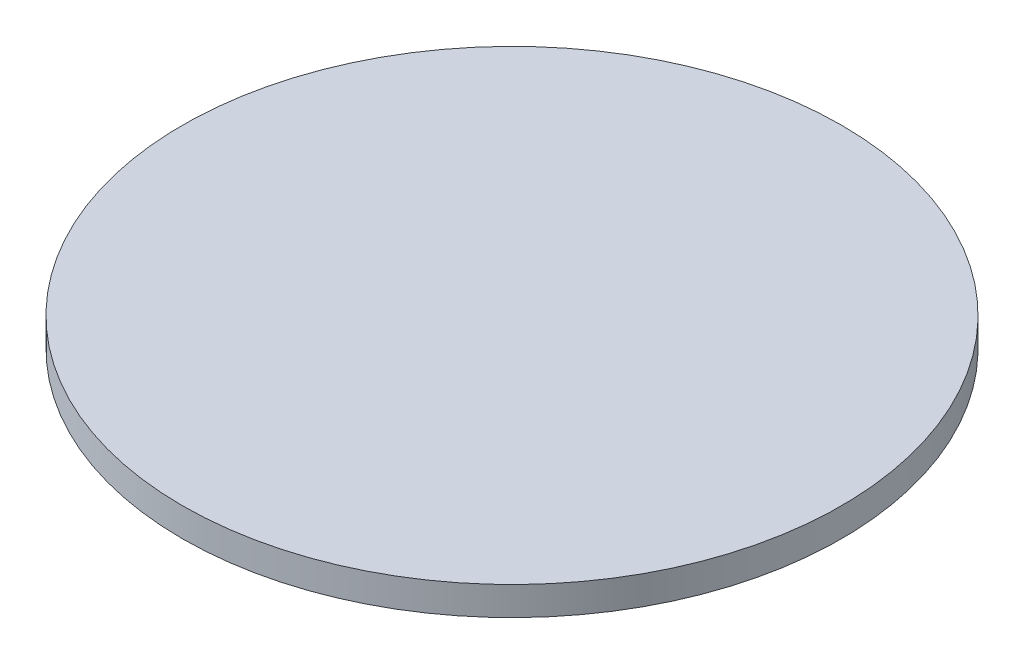
ISO-10303-21;
HEADER;
FILE_DESCRIPTION(('STEP AP214'),'2;1');
FILE_NAME('part.step','',(''),(''),'','','');
FILE_SCHEMA(('AUTOMOTIVE_DESIGN { 1 0 10303 214 1 1 1 1 }'));
ENDSEC;
DATA;
#1=APPLICATION_CONTEXT('core data for automotive mechanical design processes');
#2=APPLICATION_PROTOCOL_DEFINITION('international standard','automotive_design',2000,#1);
#3=PRODUCT_CONTEXT('',#1,'mechanical');
#4=PRODUCT('Part','Part','',(#3));
#5=PRODUCT_RELATED_PRODUCT_CATEGORY('part','',(#4));
#6=PRODUCT_DEFINITION_FORMATION('','',#4);
#7=PRODUCT_DEFINITION_CONTEXT('part definition',#1,'design');
#8=PRODUCT_DEFINITION('design','',#6,#7);
#9=PRODUCT_DEFINITION_SHAPE('','',#8);
#10=(LENGTH_UNIT() NAMED_UNIT(*) SI_UNIT(.MILLI.,.METRE.));
#11=(NAMED_UNIT(*) PLANE_ANGLE_UNIT() SI_UNIT($,.RADIAN.));
#12=(NAMED_UNIT(*) SI_UNIT($,.STERADIAN.) SOLID_ANGLE_UNIT());
#13=UNCERTAINTY_MEASURE_WITH_UNIT(LENGTH_MEASURE(1.E-05),#10,'distance_accuracy_value','');
#14=(GEOMETRIC_REPRESENTATION_CONTEXT(3) GLOBAL_UNCERTAINTY_ASSIGNED_CONTEXT((#13)) GLOBAL_UNIT_ASSIGNED_CONTEXT((#10,
#11,#12)) REPRESENTATION_CONTEXT('',''));
#15=CARTESIAN_POINT('',(0.,0.,0.));
#16=DIRECTION('',(0.,0.,1.));
#17=DIRECTION('',(1.,0.,0.));
#18=AXIS2_PLACEMENT_3D('',#15,#16,#17);
#19=CARTESIAN_POINT('',(0.,1.,0.));
#20=DIRECTION('',(0.,-1.,0.));
#21=DIRECTION('',(0.,0.,-1.));
#22=AXIS2_PLACEMENT_3D('',#19,#20,#21);
#23=CYLINDRICAL_SURFACE('',#22,11.5);
#24=CARTESIAN_POINT('',(0.,1.,0.));
#25=DIRECTION('',(0.,1.,0.));
#26=DIRECTION('',(0.,0.,1.));
#27=AXIS2_PLACEMENT_3D('',#24,#25,#26);
#28=CIRCLE('',#27,11.5);
#29=CARTESIAN_POINT('',(0.,1.,11.5));
#30=VERTEX_POINT('',#29);
#31=EDGE_CURVE('E10',#30,#30,#28,.T.);
#32=ORIENTED_EDGE('',*,*,#31,.F.);
#33=EDGE_LOOP('',(#32));
#34=FACE_BOUND('',#33,.T.);
#35=CARTESIAN_POINT('',(0.,0.,0.));
#36=DIRECTION('',(0.,1.,0.));
#37=DIRECTION('',(0.,0.,1.));
#38=AXIS2_PLACEMENT_3D('',#35,#36,#37);
#39=CIRCLE('',#38,11.5);
#40=CARTESIAN_POINT('',(0.,0.,11.5));
#41=VERTEX_POINT('',#40);
#42=EDGE_CURVE('E42',#41,#41,#39,.T.);
#43=ORIENTED_EDGE('',*,*,#42,.T.);
#44=EDGE_LOOP('',(#43));
#45=FACE_BOUND('',#44,.T.);
#46=ADVANCED_FACE('F39',(#34,#45),#23,.T.);
#47=CARTESIAN_POINT('',(0.,1.,0.));
#48=DIRECTION('',(0.,1.,0.));
#49=DIRECTION('',(0.,0.,1.));
#50=AXIS2_PLACEMENT_3D('',#47,#48,#49);
#51=PLANE('',#50);
#52=ORIENTED_EDGE('',*,*,#31,.T.);
#53=EDGE_LOOP('',(#52));
#54=FACE_BOUND('',#53,.T.);
#55=ADVANCED_FACE('F54',(#54),#51,.T.);
#56=CARTESIAN_POINT('',(0.,0.,0.));
#57=DIRECTION('',(0.,1.,0.));
#58=DIRECTION('',(0.,0.,1.));
#59=AXIS2_PLACEMENT_3D('',#56,#57,#58);
#60=PLANE('',#59);
#61=ORIENTED_EDGE('',*,*,#42,.F.);
#62=EDGE_LOOP('',(#61));
#63=FACE_BOUND('',#62,.T.);
#64=ADVANCED_FACE('F52',(#63),#60,.F.);
#65=CLOSED_SHELL('',(#46,#55,#64));
#66=MANIFOLD_SOLID_BREP('B2',#65);
#67=ADVANCED_BREP_SHAPE_REPRESENTATION('',(#18,#66),#14);
#68=SHAPE_DEFINITION_REPRESENTATION(#9,#67);
ENDSEC;
END-ISO-10303-21;
